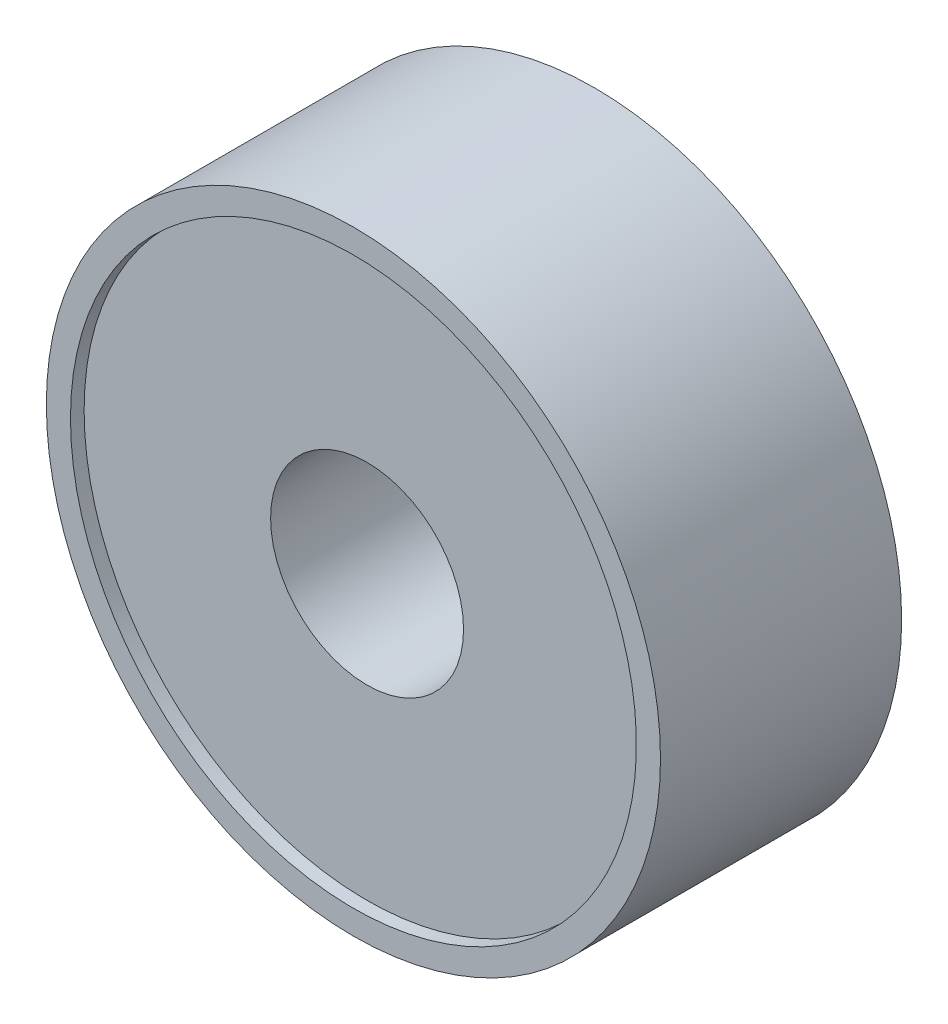
ISO-10303-21;
HEADER;
FILE_DESCRIPTION(('STEP AP214'),'2;1');
FILE_NAME('part.step','',(''),(''),'','','');
FILE_SCHEMA(('AUTOMOTIVE_DESIGN { 1 0 10303 214 1 1 1 1 }'));
ENDSEC;
DATA;
#1=APPLICATION_CONTEXT('core data for automotive mechanical design processes');
#2=APPLICATION_PROTOCOL_DEFINITION('international standard','automotive_design',2000,#1);
#3=PRODUCT_CONTEXT('',#1,'mechanical');
#4=PRODUCT('Part','Part','',(#3));
#5=PRODUCT_RELATED_PRODUCT_CATEGORY('part','',(#4));
#6=PRODUCT_DEFINITION_FORMATION('','',#4);
#7=PRODUCT_DEFINITION_CONTEXT('part definition',#1,'design');
#8=PRODUCT_DEFINITION('design','',#6,#7);
#9=PRODUCT_DEFINITION_SHAPE('','',#8);
#10=(LENGTH_UNIT() NAMED_UNIT(*) SI_UNIT(.MILLI.,.METRE.));
#11=(NAMED_UNIT(*) PLANE_ANGLE_UNIT() SI_UNIT($,.RADIAN.));
#12=(NAMED_UNIT(*) SI_UNIT($,.STERADIAN.) SOLID_ANGLE_UNIT());
#13=UNCERTAINTY_MEASURE_WITH_UNIT(LENGTH_MEASURE(1.E-05),#10,'distance_accuracy_value','');
#14=(GEOMETRIC_REPRESENTATION_CONTEXT(3) GLOBAL_UNCERTAINTY_ASSIGNED_CONTEXT((#13)) GLOBAL_UNIT_ASSIGNED_CONTEXT((#10,
#11,#12)) REPRESENTATION_CONTEXT('',''));
#15=CARTESIAN_POINT('',(0.,0.,0.));
#16=DIRECTION('',(0.,0.,1.));
#17=DIRECTION('',(1.,0.,0.));
#18=AXIS2_PLACEMENT_3D('',#15,#16,#17);
#19=CARTESIAN_POINT('',(0.,-44.704,-16.8947385309434));
#20=DIRECTION('',(0.,0.,1.));
#21=DIRECTION('',(1.,0.,0.));
#22=AXIS2_PLACEMENT_3D('',#19,#20,#21);
#23=PLANE('',#22);
#24=CARTESIAN_POINT('',(0.,0.,-16.8947385309434));
#25=DIRECTION('',(0.,0.,-1.));
#26=DIRECTION('',(-1.,0.,0.));
#27=AXIS2_PLACEMENT_3D('',#24,#25,#26);
#28=CIRCLE('',#27,15.24);
#29=CARTESIAN_POINT('',(-15.24,0.,-16.8947385309434));
#30=VERTEX_POINT('',#29);
#31=EDGE_CURVE('E65',#30,#30,#28,.T.);
#32=ORIENTED_EDGE('',*,*,#31,.F.);
#33=EDGE_LOOP('',(#32));
#34=FACE_BOUND('',#33,.T.);
#35=CARTESIAN_POINT('',(0.,0.,-16.8947385309434));
#36=DIRECTION('',(0.,0.,-1.));
#37=DIRECTION('',(-1.,0.,0.));
#38=AXIS2_PLACEMENT_3D('',#35,#36,#37);
#39=CIRCLE('',#38,44.704);
#40=CARTESIAN_POINT('',(-44.704,0.,-16.8947385309434));
#41=VERTEX_POINT('',#40);
#42=EDGE_CURVE('E10',#41,#41,#39,.T.);
#43=ORIENTED_EDGE('',*,*,#42,.T.);
#44=EDGE_LOOP('',(#43));
#45=FACE_BOUND('',#44,.T.);
#46=ADVANCED_FACE('F37',(#34,#45),#23,.F.);
#47=CARTESIAN_POINT('',(0.,0.,0.));
#48=DIRECTION('',(0.,0.,-1.));
#49=DIRECTION('',(-1.,0.,0.));
#50=AXIS2_PLACEMENT_3D('',#47,#48,#49);
#51=CYLINDRICAL_SURFACE('',#50,44.704);
#52=ORIENTED_EDGE('',*,*,#42,.F.);
#53=EDGE_LOOP('',(#52));
#54=FACE_BOUND('',#53,.T.);
#55=CARTESIAN_POINT('',(0.,0.,-19.05));
#56=DIRECTION('',(0.,0.,-1.));
#57=DIRECTION('',(-1.,0.,0.));
#58=AXIS2_PLACEMENT_3D('',#55,#56,#57);
#59=CIRCLE('',#58,44.704);
#60=CARTESIAN_POINT('',(-44.704,0.,-19.05));
#61=VERTEX_POINT('',#60);
#62=EDGE_CURVE('E43',#61,#61,#59,.T.);
#63=ORIENTED_EDGE('',*,*,#62,.T.);
#64=EDGE_LOOP('',(#63));
#65=FACE_BOUND('',#64,.T.);
#66=ADVANCED_FACE('F72',(#54,#65),#51,.F.);
#67=CARTESIAN_POINT('',(0.,-48.514,-19.05));
#68=DIRECTION('',(0.,0.,1.));
#69=DIRECTION('',(1.,0.,0.));
#70=AXIS2_PLACEMENT_3D('',#67,#68,#69);
#71=PLANE('',#70);
#72=ORIENTED_EDGE('',*,*,#62,.F.);
#73=EDGE_LOOP('',(#72));
#74=FACE_BOUND('',#73,.T.);
#75=CARTESIAN_POINT('',(0.,0.,-19.05));
#76=DIRECTION('',(0.,0.,-1.));
#77=DIRECTION('',(-1.,0.,0.));
#78=AXIS2_PLACEMENT_3D('',#75,#76,#77);
#79=CIRCLE('',#78,48.514);
#80=CARTESIAN_POINT('',(-48.514,0.,-19.05));
#81=VERTEX_POINT('',#80);
#82=EDGE_CURVE('E47',#81,#81,#79,.T.);
#83=ORIENTED_EDGE('',*,*,#82,.T.);
#84=EDGE_LOOP('',(#83));
#85=FACE_BOUND('',#84,.T.);
#86=ADVANCED_FACE('F76',(#74,#85),#71,.F.);
#87=CARTESIAN_POINT('',(0.,0.,0.));
#88=DIRECTION('',(0.,0.,-1.));
#89=DIRECTION('',(-1.,0.,0.));
#90=AXIS2_PLACEMENT_3D('',#87,#88,#89);
#91=CYLINDRICAL_SURFACE('',#90,48.514);
#92=ORIENTED_EDGE('',*,*,#82,.F.);
#93=EDGE_LOOP('',(#92));
#94=FACE_BOUND('',#93,.T.);
#95=CARTESIAN_POINT('',(0.,0.,19.05));
#96=DIRECTION('',(0.,0.,-1.));
#97=DIRECTION('',(-1.,0.,0.));
#98=AXIS2_PLACEMENT_3D('',#95,#96,#97);
#99=CIRCLE('',#98,48.514);
#100=CARTESIAN_POINT('',(-48.514,0.,19.05));
#101=VERTEX_POINT('',#100);
#102=EDGE_CURVE('E51',#101,#101,#99,.T.);
#103=ORIENTED_EDGE('',*,*,#102,.T.);
#104=EDGE_LOOP('',(#103));
#105=FACE_BOUND('',#104,.T.);
#106=ADVANCED_FACE('F81',(#94,#105),#91,.T.);
#107=CARTESIAN_POINT('',(0.,-48.514,19.05));
#108=DIRECTION('',(0.,0.,-1.));
#109=DIRECTION('',(-1.,0.,0.));
#110=AXIS2_PLACEMENT_3D('',#107,#108,#109);
#111=PLANE('',#110);
#112=ORIENTED_EDGE('',*,*,#102,.F.);
#113=EDGE_LOOP('',(#112));
#114=FACE_BOUND('',#113,.T.);
#115=CARTESIAN_POINT('',(0.,0.,19.05));
#116=DIRECTION('',(0.,0.,-1.));
#117=DIRECTION('',(-1.,0.,0.));
#118=AXIS2_PLACEMENT_3D('',#115,#116,#117);
#119=CIRCLE('',#118,44.704);
#120=CARTESIAN_POINT('',(-44.704,0.,19.05));
#121=VERTEX_POINT('',#120);
#122=EDGE_CURVE('E56',#121,#121,#119,.T.);
#123=ORIENTED_EDGE('',*,*,#122,.T.);
#124=EDGE_LOOP('',(#123));
#125=FACE_BOUND('',#124,.T.);
#126=ADVANCED_FACE('F87',(#114,#125),#111,.F.);
#127=CARTESIAN_POINT('',(0.,0.,0.));
#128=DIRECTION('',(0.,0.,-1.));
#129=DIRECTION('',(-1.,0.,0.));
#130=AXIS2_PLACEMENT_3D('',#127,#128,#129);
#131=CYLINDRICAL_SURFACE('',#130,44.704);
#132=ORIENTED_EDGE('',*,*,#122,.F.);
#133=EDGE_LOOP('',(#132));
#134=FACE_BOUND('',#133,.T.);
#135=CARTESIAN_POINT('',(0.,0.,16.8947385309434));
#136=DIRECTION('',(0.,0.,-1.));
#137=DIRECTION('',(-1.,0.,0.));
#138=AXIS2_PLACEMENT_3D('',#135,#136,#137);
#139=CIRCLE('',#138,44.704);
#140=CARTESIAN_POINT('',(-44.704,0.,16.8947385309434));
#141=VERTEX_POINT('',#140);
#142=EDGE_CURVE('E59',#141,#141,#139,.T.);
#143=ORIENTED_EDGE('',*,*,#142,.T.);
#144=EDGE_LOOP('',(#143));
#145=FACE_BOUND('',#144,.T.);
#146=ADVANCED_FACE('F91',(#134,#145),#131,.F.);
#147=CARTESIAN_POINT('',(0.,-44.704,16.8947385309434));
#148=DIRECTION('',(0.,0.,-1.));
#149=DIRECTION('',(-1.,0.,0.));
#150=AXIS2_PLACEMENT_3D('',#147,#148,#149);
#151=PLANE('',#150);
#152=ORIENTED_EDGE('',*,*,#142,.F.);
#153=EDGE_LOOP('',(#152));
#154=FACE_BOUND('',#153,.T.);
#155=CARTESIAN_POINT('',(0.,0.,16.8947385309434));
#156=DIRECTION('',(0.,0.,-1.));
#157=DIRECTION('',(-1.,0.,0.));
#158=AXIS2_PLACEMENT_3D('',#155,#156,#157);
#159=CIRCLE('',#158,15.24);
#160=CARTESIAN_POINT('',(-15.24,0.,16.8947385309434));
#161=VERTEX_POINT('',#160);
#162=EDGE_CURVE('E62',#161,#161,#159,.T.);
#163=ORIENTED_EDGE('',*,*,#162,.T.);
#164=EDGE_LOOP('',(#163));
#165=FACE_BOUND('',#164,.T.);
#166=ADVANCED_FACE('F95',(#154,#165),#151,.F.);
#167=CARTESIAN_POINT('',(0.,0.,0.));
#168=DIRECTION('',(0.,0.,-1.));
#169=DIRECTION('',(-1.,0.,0.));
#170=AXIS2_PLACEMENT_3D('',#167,#168,#169);
#171=CYLINDRICAL_SURFACE('',#170,15.24);
#172=ORIENTED_EDGE('',*,*,#162,.F.);
#173=EDGE_LOOP('',(#172));
#174=FACE_BOUND('',#173,.T.);
#175=ORIENTED_EDGE('',*,*,#31,.T.);
#176=EDGE_LOOP('',(#175));
#177=FACE_BOUND('',#176,.T.);
#178=ADVANCED_FACE('F69',(#174,#177),#171,.F.);
#179=CLOSED_SHELL('',(#46,#66,#86,#106,#126,#146,#166,#178));
#180=MANIFOLD_SOLID_BREP('B2',#179);
#181=ADVANCED_BREP_SHAPE_REPRESENTATION('',(#18,#180),#14);
#182=SHAPE_DEFINITION_REPRESENTATION(#9,#181);
ENDSEC;
END-ISO-10303-21;
